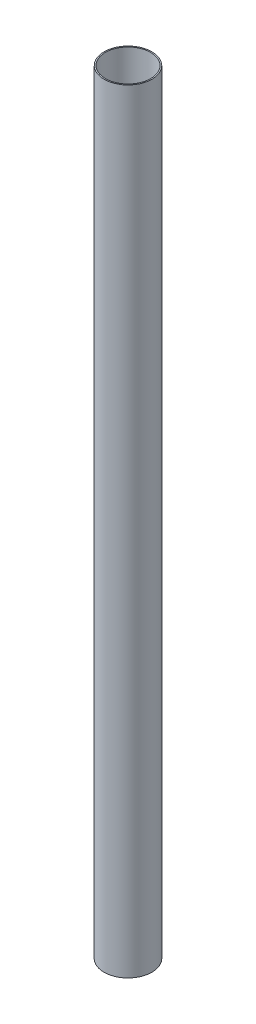
ISO-10303-21;
HEADER;
FILE_DESCRIPTION(('STEP AP214'),'2;1');
FILE_NAME('part.step','',(''),(''),'','','');
FILE_SCHEMA(('AUTOMOTIVE_DESIGN { 1 0 10303 214 1 1 1 1 }'));
ENDSEC;
DATA;
#1=APPLICATION_CONTEXT('core data for automotive mechanical design processes');
#2=APPLICATION_PROTOCOL_DEFINITION('international standard','automotive_design',2000,#1);
#3=PRODUCT_CONTEXT('',#1,'mechanical');
#4=PRODUCT('Part','Part','',(#3));
#5=PRODUCT_RELATED_PRODUCT_CATEGORY('part','',(#4));
#6=PRODUCT_DEFINITION_FORMATION('','',#4);
#7=PRODUCT_DEFINITION_CONTEXT('part definition',#1,'design');
#8=PRODUCT_DEFINITION('design','',#6,#7);
#9=PRODUCT_DEFINITION_SHAPE('','',#8);
#10=(LENGTH_UNIT() NAMED_UNIT(*) SI_UNIT(.MILLI.,.METRE.));
#11=(NAMED_UNIT(*) PLANE_ANGLE_UNIT() SI_UNIT($,.RADIAN.));
#12=(NAMED_UNIT(*) SI_UNIT($,.STERADIAN.) SOLID_ANGLE_UNIT());
#13=UNCERTAINTY_MEASURE_WITH_UNIT(LENGTH_MEASURE(1.E-05),#10,'distance_accuracy_value','');
#14=(GEOMETRIC_REPRESENTATION_CONTEXT(3) GLOBAL_UNCERTAINTY_ASSIGNED_CONTEXT((#13)) GLOBAL_UNIT_ASSIGNED_CONTEXT((#10,
#11,#12)) REPRESENTATION_CONTEXT('',''));
#15=CARTESIAN_POINT('',(0.,0.,0.));
#16=DIRECTION('',(0.,0.,1.));
#17=DIRECTION('',(1.,0.,0.));
#18=AXIS2_PLACEMENT_3D('',#15,#16,#17);
#19=CARTESIAN_POINT('',(0.,514.,0.));
#20=DIRECTION('',(0.,-1.,0.));
#21=DIRECTION('',(0.,0.,-1.));
#22=AXIS2_PLACEMENT_3D('',#19,#20,#21);
#23=CYLINDRICAL_SURFACE('',#22,15.875);
#24=CARTESIAN_POINT('',(0.,514.,0.));
#25=DIRECTION('',(0.,1.,0.));
#26=DIRECTION('',(0.,0.,1.));
#27=AXIS2_PLACEMENT_3D('',#24,#25,#26);
#28=CIRCLE('',#27,15.875);
#29=CARTESIAN_POINT('',(0.,514.,15.875));
#30=VERTEX_POINT('',#29);
#31=EDGE_CURVE('E10',#30,#30,#28,.T.);
#32=ORIENTED_EDGE('',*,*,#31,.F.);
#33=EDGE_LOOP('',(#32));
#34=FACE_BOUND('',#33,.T.);
#35=CARTESIAN_POINT('',(0.,0.,0.));
#36=DIRECTION('',(0.,1.,0.));
#37=DIRECTION('',(0.,0.,1.));
#38=AXIS2_PLACEMENT_3D('',#35,#36,#37);
#39=CIRCLE('',#38,15.875);
#40=CARTESIAN_POINT('',(0.,0.,15.875));
#41=VERTEX_POINT('',#40);
#42=EDGE_CURVE('E34',#41,#41,#39,.T.);
#43=ORIENTED_EDGE('',*,*,#42,.T.);
#44=EDGE_LOOP('',(#43));
#45=FACE_BOUND('',#44,.T.);
#46=ADVANCED_FACE('F31',(#34,#45),#23,.T.);
#47=CARTESIAN_POINT('',(0.,514.,0.));
#48=DIRECTION('',(0.,1.,0.));
#49=DIRECTION('',(0.,0.,1.));
#50=AXIS2_PLACEMENT_3D('',#47,#48,#49);
#51=PLANE('',#50);
#52=CARTESIAN_POINT('',(0.,514.,0.));
#53=DIRECTION('',(0.,-1.,0.));
#54=DIRECTION('',(0.,0.,-1.));
#55=AXIS2_PLACEMENT_3D('',#52,#53,#54);
#56=CIRCLE('',#55,15.075);
#57=CARTESIAN_POINT('',(0.,514.,-15.075));
#58=VERTEX_POINT('',#57);
#59=EDGE_CURVE('E41',#58,#58,#56,.T.);
#60=ORIENTED_EDGE('',*,*,#59,.T.);
#61=EDGE_LOOP('',(#60));
#62=FACE_BOUND('',#61,.T.);
#63=ORIENTED_EDGE('',*,*,#31,.T.);
#64=EDGE_LOOP('',(#63));
#65=FACE_BOUND('',#64,.T.);
#66=ADVANCED_FACE('F49',(#62,#65),#51,.T.);
#67=CARTESIAN_POINT('',(0.,0.,0.));
#68=DIRECTION('',(0.,1.,0.));
#69=DIRECTION('',(0.,0.,1.));
#70=AXIS2_PLACEMENT_3D('',#67,#68,#69);
#71=PLANE('',#70);
#72=CARTESIAN_POINT('',(0.,0.,0.));
#73=DIRECTION('',(0.,-1.,0.));
#74=DIRECTION('',(0.,0.,-1.));
#75=AXIS2_PLACEMENT_3D('',#72,#73,#74);
#76=CIRCLE('',#75,15.075);
#77=CARTESIAN_POINT('',(0.,0.,-15.075));
#78=VERTEX_POINT('',#77);
#79=EDGE_CURVE('E43',#78,#78,#76,.T.);
#80=ORIENTED_EDGE('',*,*,#79,.F.);
#81=EDGE_LOOP('',(#80));
#82=FACE_BOUND('',#81,.T.);
#83=ORIENTED_EDGE('',*,*,#42,.F.);
#84=EDGE_LOOP('',(#83));
#85=FACE_BOUND('',#84,.T.);
#86=ADVANCED_FACE('F54',(#82,#85),#71,.F.);
#87=CARTESIAN_POINT('',(0.,514.,0.));
#88=DIRECTION('',(0.,-1.,0.));
#89=DIRECTION('',(0.,0.,-1.));
#90=AXIS2_PLACEMENT_3D('',#87,#88,#89);
#91=CYLINDRICAL_SURFACE('',#90,15.075);
#92=ORIENTED_EDGE('',*,*,#59,.F.);
#93=EDGE_LOOP('',(#92));
#94=FACE_BOUND('',#93,.T.);
#95=ORIENTED_EDGE('',*,*,#79,.T.);
#96=EDGE_LOOP('',(#95));
#97=FACE_BOUND('',#96,.T.);
#98=ADVANCED_FACE('F51',(#94,#97),#91,.F.);
#99=CLOSED_SHELL('',(#46,#66,#86,#98));
#100=MANIFOLD_SOLID_BREP('B2',#99);
#101=ADVANCED_BREP_SHAPE_REPRESENTATION('',(#18,#100),#14);
#102=SHAPE_DEFINITION_REPRESENTATION(#9,#101);
ENDSEC;
END-ISO-10303-21;
